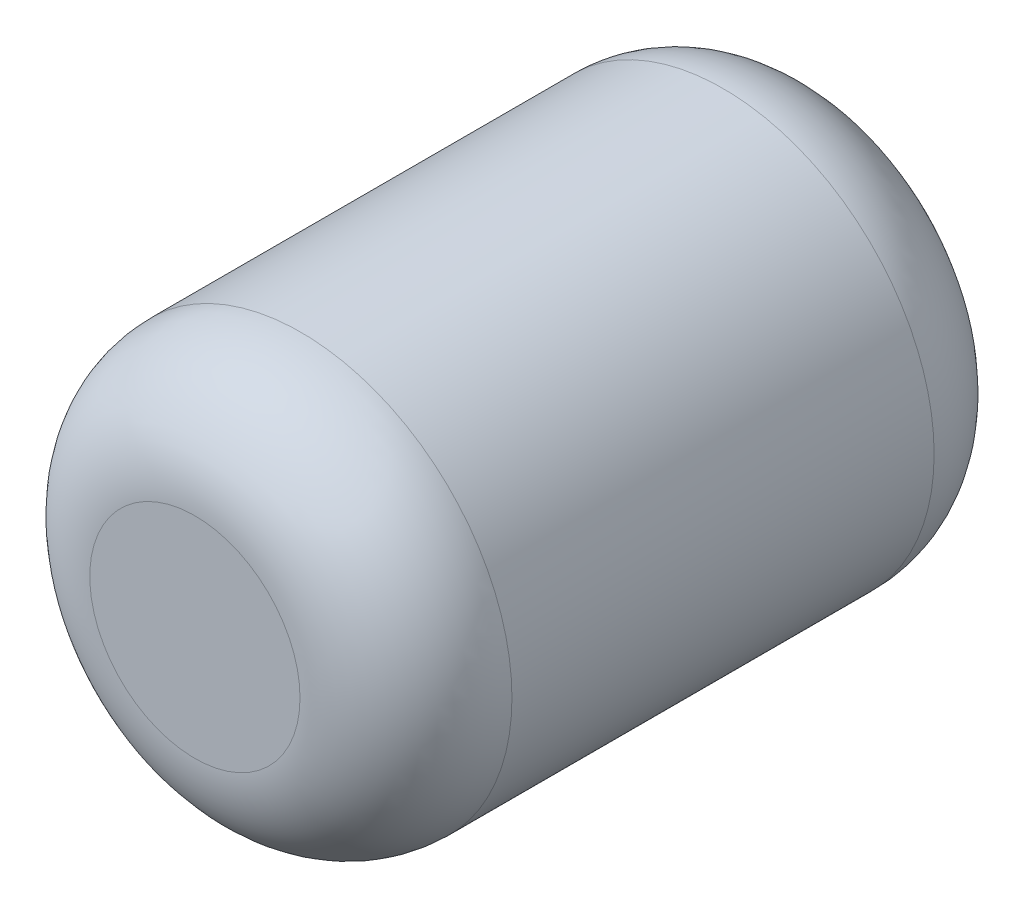
ISO-10303-21;
HEADER;
FILE_DESCRIPTION(('STEP AP214'),'2;1');
FILE_NAME('part.step','',(''),(''),'','','');
FILE_SCHEMA(('AUTOMOTIVE_DESIGN { 1 0 10303 214 1 1 1 1 }'));
ENDSEC;
DATA;
#1=APPLICATION_CONTEXT('core data for automotive mechanical design processes');
#2=APPLICATION_PROTOCOL_DEFINITION('international standard','automotive_design',2000,#1);
#3=PRODUCT_CONTEXT('',#1,'mechanical');
#4=PRODUCT('Part','Part','',(#3));
#5=PRODUCT_RELATED_PRODUCT_CATEGORY('part','',(#4));
#6=PRODUCT_DEFINITION_FORMATION('','',#4);
#7=PRODUCT_DEFINITION_CONTEXT('part definition',#1,'design');
#8=PRODUCT_DEFINITION('design','',#6,#7);
#9=PRODUCT_DEFINITION_SHAPE('','',#8);
#10=(LENGTH_UNIT() NAMED_UNIT(*) SI_UNIT(.MILLI.,.METRE.));
#11=(NAMED_UNIT(*) PLANE_ANGLE_UNIT() SI_UNIT($,.RADIAN.));
#12=(NAMED_UNIT(*) SI_UNIT($,.STERADIAN.) SOLID_ANGLE_UNIT());
#13=UNCERTAINTY_MEASURE_WITH_UNIT(LENGTH_MEASURE(1.E-05),#10,'distance_accuracy_value','');
#14=(GEOMETRIC_REPRESENTATION_CONTEXT(3) GLOBAL_UNCERTAINTY_ASSIGNED_CONTEXT((#13)) GLOBAL_UNIT_ASSIGNED_CONTEXT((#10,
#11,#12)) REPRESENTATION_CONTEXT('',''));
#15=CARTESIAN_POINT('',(0.,0.,0.));
#16=DIRECTION('',(0.,0.,1.));
#17=DIRECTION('',(1.,0.,0.));
#18=AXIS2_PLACEMENT_3D('',#15,#16,#17);
#19=CARTESIAN_POINT('',(0.,0.,151.9936));
#20=DIRECTION('',(0.,0.,-1.));
#21=DIRECTION('',(-1.,0.,0.));
#22=AXIS2_PLACEMENT_3D('',#19,#20,#21);
#23=CYLINDRICAL_SURFACE('',#22,50.5968);
#24=CARTESIAN_POINT('',(0.,0.,25.4));
#25=DIRECTION('',(0.,0.,1.));
#26=DIRECTION('',(1.,0.,0.));
#27=AXIS2_PLACEMENT_3D('',#24,#25,#26);
#28=CIRCLE('',#27,50.5968);
#29=CARTESIAN_POINT('',(50.5968,0.,25.4));
#30=VERTEX_POINT('',#29);
#31=EDGE_CURVE('E42',#30,#30,#28,.T.);
#32=ORIENTED_EDGE('',*,*,#31,.T.);
#33=EDGE_LOOP('',(#32));
#34=FACE_BOUND('',#33,.T.);
#35=CARTESIAN_POINT('',(0.,0.,126.5936));
#36=DIRECTION('',(0.,0.,1.));
#37=DIRECTION('',(1.,0.,0.));
#38=AXIS2_PLACEMENT_3D('',#35,#36,#37);
#39=CIRCLE('',#38,50.5968);
#40=CARTESIAN_POINT('',(50.5968,0.,126.5936));
#41=VERTEX_POINT('',#40);
#42=EDGE_CURVE('E46',#41,#41,#39,.F.);
#43=ORIENTED_EDGE('',*,*,#42,.T.);
#44=EDGE_LOOP('',(#43));
#45=FACE_BOUND('',#44,.T.);
#46=ADVANCED_FACE('F31',(#34,#45),#23,.T.);
#47=CARTESIAN_POINT('',(0.,0.,151.9936));
#48=DIRECTION('',(0.,0.,1.));
#49=DIRECTION('',(1.,0.,0.));
#50=AXIS2_PLACEMENT_3D('',#47,#48,#49);
#51=PLANE('',#50);
#52=CARTESIAN_POINT('',(0.,0.,151.9936));
#53=DIRECTION('',(0.,0.,1.));
#54=DIRECTION('',(1.,0.,0.));
#55=AXIS2_PLACEMENT_3D('',#52,#53,#54);
#56=CIRCLE('',#55,25.1968);
#57=CARTESIAN_POINT('',(25.1968,0.,151.9936));
#58=VERTEX_POINT('',#57);
#59=EDGE_CURVE('E10',#58,#58,#56,.T.);
#60=ORIENTED_EDGE('',*,*,#59,.T.);
#61=EDGE_LOOP('',(#60));
#62=FACE_BOUND('',#61,.T.);
#63=ADVANCED_FACE('F62',(#62),#51,.T.);
#64=CARTESIAN_POINT('',(0.,0.,0.));
#65=DIRECTION('',(0.,0.,1.));
#66=DIRECTION('',(1.,0.,0.));
#67=AXIS2_PLACEMENT_3D('',#64,#65,#66);
#68=PLANE('',#67);
#69=CARTESIAN_POINT('',(0.,0.,0.));
#70=DIRECTION('',(0.,0.,1.));
#71=DIRECTION('',(1.,0.,0.));
#72=AXIS2_PLACEMENT_3D('',#69,#70,#71);
#73=CIRCLE('',#72,25.1968);
#74=CARTESIAN_POINT('',(25.1968,0.,0.));
#75=VERTEX_POINT('',#74);
#76=EDGE_CURVE('E38',#75,#75,#73,.F.);
#77=ORIENTED_EDGE('',*,*,#76,.T.);
#78=EDGE_LOOP('',(#77));
#79=FACE_BOUND('',#78,.T.);
#80=ADVANCED_FACE('F59',(#79),#68,.F.);
#81=CARTESIAN_POINT('',(0.,0.,25.4));
#82=DIRECTION('',(0.,0.,1.));
#83=DIRECTION('',(1.,0.,0.));
#84=AXIS2_PLACEMENT_3D('',#81,#82,#83);
#85=DEGENERATE_TOROIDAL_SURFACE('',#84,25.1968,25.4,.T.);
#86=ORIENTED_EDGE('',*,*,#76,.F.);
#87=EDGE_LOOP('',(#86));
#88=FACE_BOUND('',#87,.T.);
#89=ORIENTED_EDGE('',*,*,#31,.F.);
#90=EDGE_LOOP('',(#89));
#91=FACE_BOUND('',#90,.T.);
#92=ADVANCED_FACE('F55',(#88,#91),#85,.T.);
#93=CARTESIAN_POINT('',(0.,0.,126.5936));
#94=DIRECTION('',(0.,0.,1.));
#95=DIRECTION('',(1.,0.,0.));
#96=AXIS2_PLACEMENT_3D('',#93,#94,#95);
#97=DEGENERATE_TOROIDAL_SURFACE('',#96,25.1968,25.4,.T.);
#98=ORIENTED_EDGE('',*,*,#42,.F.);
#99=EDGE_LOOP('',(#98));
#100=FACE_BOUND('',#99,.T.);
#101=ORIENTED_EDGE('',*,*,#59,.F.);
#102=EDGE_LOOP('',(#101));
#103=FACE_BOUND('',#102,.T.);
#104=ADVANCED_FACE('F33',(#100,#103),#97,.T.);
#105=CLOSED_SHELL('',(#46,#63,#80,#92,#104));
#106=MANIFOLD_SOLID_BREP('B2',#105);
#107=ADVANCED_BREP_SHAPE_REPRESENTATION('',(#18,#106),#14);
#108=SHAPE_DEFINITION_REPRESENTATION(#9,#107);
ENDSEC;
END-ISO-10303-21;
